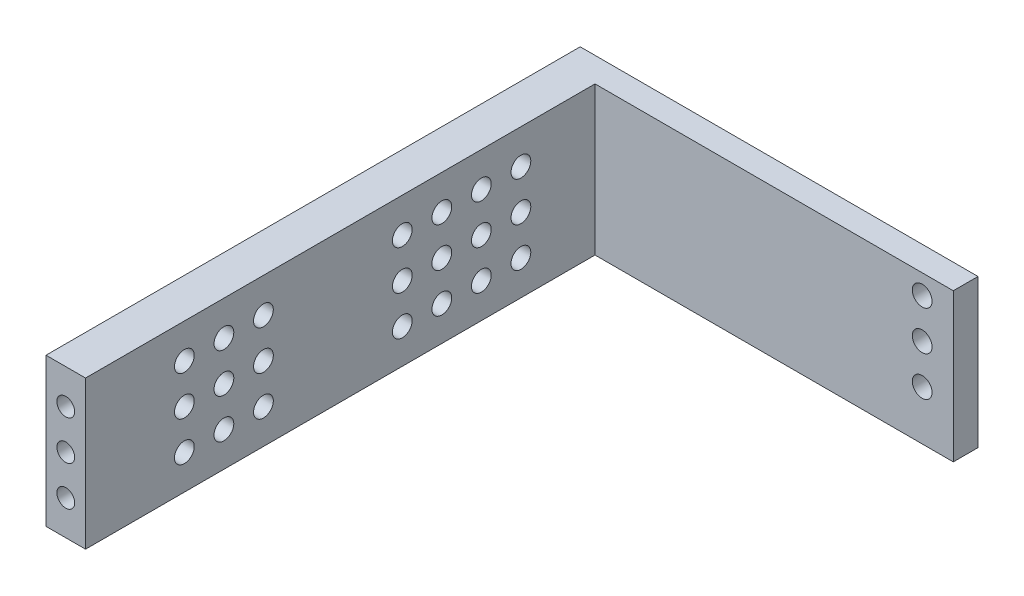
ISO-10303-21;
HEADER;
FILE_DESCRIPTION(('STEP AP214'),'2;1');
FILE_NAME('part.step','',(''),(''),'','','');
FILE_SCHEMA(('AUTOMOTIVE_DESIGN { 1 0 10303 214 1 1 1 1 }'));
ENDSEC;
DATA;
#1=APPLICATION_CONTEXT('core data for automotive mechanical design processes');
#2=APPLICATION_PROTOCOL_DEFINITION('international standard','automotive_design',2000,#1);
#3=PRODUCT_CONTEXT('',#1,'mechanical');
#4=PRODUCT('Part','Part','',(#3));
#5=PRODUCT_RELATED_PRODUCT_CATEGORY('part','',(#4));
#6=PRODUCT_DEFINITION_FORMATION('','',#4);
#7=PRODUCT_DEFINITION_CONTEXT('part definition',#1,'design');
#8=PRODUCT_DEFINITION('design','',#6,#7);
#9=PRODUCT_DEFINITION_SHAPE('','',#8);
#10=(LENGTH_UNIT() NAMED_UNIT(*) SI_UNIT(.MILLI.,.METRE.));
#11=(NAMED_UNIT(*) PLANE_ANGLE_UNIT() SI_UNIT($,.RADIAN.));
#12=(NAMED_UNIT(*) SI_UNIT($,.STERADIAN.) SOLID_ANGLE_UNIT());
#13=UNCERTAINTY_MEASURE_WITH_UNIT(LENGTH_MEASURE(1.E-05),#10,'distance_accuracy_value','');
#14=(GEOMETRIC_REPRESENTATION_CONTEXT(3) GLOBAL_UNCERTAINTY_ASSIGNED_CONTEXT((#13)) GLOBAL_UNIT_ASSIGNED_CONTEXT((#10,
#11,#12)) REPRESENTATION_CONTEXT('',''));
#15=CARTESIAN_POINT('',(0.,0.,0.));
#16=DIRECTION('',(0.,0.,1.));
#17=DIRECTION('',(1.,0.,0.));
#18=AXIS2_PLACEMENT_3D('',#15,#16,#17);
#19=CARTESIAN_POINT('',(8.00000000000002,30.,0.));
#20=DIRECTION('',(0.,0.,-1.));
#21=DIRECTION('',(-1.,0.,0.));
#22=AXIS2_PLACEMENT_3D('',#19,#20,#21);
#23=PLANE('',#22);
#24=CARTESIAN_POINT('',(4.00000000000001,23.,0.));
#25=DIRECTION('',(0.,0.,1.));
#26=DIRECTION('',(1.,0.,0.));
#27=AXIS2_PLACEMENT_3D('',#24,#25,#26);
#28=CIRCLE('',#27,1.8);
#29=CARTESIAN_POINT('',(5.80000000000001,23.,0.));
#30=VERTEX_POINT('',#29);
#31=EDGE_CURVE('E164',#30,#30,#28,.T.);
#32=ORIENTED_EDGE('',*,*,#31,.F.);
#33=EDGE_LOOP('',(#32));
#34=FACE_BOUND('',#33,.T.);
#35=CARTESIAN_POINT('',(4.00000000000001,7.,0.));
#36=DIRECTION('',(0.,0.,1.));
#37=DIRECTION('',(1.,0.,0.));
#38=AXIS2_PLACEMENT_3D('',#35,#36,#37);
#39=CIRCLE('',#38,1.8);
#40=CARTESIAN_POINT('',(5.80000000000001,7.,0.));
#41=VERTEX_POINT('',#40);
#42=EDGE_CURVE('E168',#41,#41,#39,.T.);
#43=ORIENTED_EDGE('',*,*,#42,.F.);
#44=EDGE_LOOP('',(#43));
#45=FACE_BOUND('',#44,.T.);
#46=CARTESIAN_POINT('',(4.00000000000001,15.,0.));
#47=DIRECTION('',(0.,0.,1.));
#48=DIRECTION('',(1.,0.,0.));
#49=AXIS2_PLACEMENT_3D('',#46,#47,#48);
#50=CIRCLE('',#49,1.8);
#51=CARTESIAN_POINT('',(5.80000000000001,15.,0.));
#52=VERTEX_POINT('',#51);
#53=EDGE_CURVE('E171',#52,#52,#50,.T.);
#54=ORIENTED_EDGE('',*,*,#53,.F.);
#55=EDGE_LOOP('',(#54));
#56=FACE_BOUND('',#55,.T.);
#57=DIRECTION('',(1.,0.,0.));
#58=VECTOR('',#57,1.);
#59=CARTESIAN_POINT('',(8.00000000000002,0.,0.));
#60=LINE('',#59,#58);
#61=CARTESIAN_POINT('',(0.,0.,0.));
#62=VERTEX_POINT('',#61);
#63=CARTESIAN_POINT('',(8.00000000000002,0.,0.));
#64=VERTEX_POINT('',#63);
#65=EDGE_CURVE('E116',#62,#64,#60,.T.);
#66=ORIENTED_EDGE('',*,*,#65,.T.);
#67=DIRECTION('',(0.,-1.,0.));
#68=VECTOR('',#67,1.);
#69=CARTESIAN_POINT('',(8.00000000000002,30.,0.));
#70=LINE('',#69,#68);
#71=CARTESIAN_POINT('',(8.00000000000002,30.,0.));
#72=VERTEX_POINT('',#71);
#73=EDGE_CURVE('E11',#72,#64,#70,.T.);
#74=ORIENTED_EDGE('',*,*,#73,.F.);
#75=DIRECTION('',(1.,0.,0.));
#76=VECTOR('',#75,1.);
#77=CARTESIAN_POINT('',(8.00000000000002,30.,0.));
#78=LINE('',#77,#76);
#79=CARTESIAN_POINT('',(0.,30.,0.));
#80=VERTEX_POINT('',#79);
#81=EDGE_CURVE('E127',#80,#72,#78,.T.);
#82=ORIENTED_EDGE('',*,*,#81,.F.);
#83=DIRECTION('',(0.,-1.,0.));
#84=VECTOR('',#83,1.);
#85=CARTESIAN_POINT('',(0.,30.,0.));
#86=LINE('',#85,#84);
#87=EDGE_CURVE('E112',#80,#62,#86,.T.);
#88=ORIENTED_EDGE('',*,*,#87,.T.);
#89=EDGE_LOOP('',(#66,#74,#82,#88));
#90=FACE_BOUND('',#89,.T.);
#91=ADVANCED_FACE('F32',(#34,#45,#56,#90),#23,.F.);
#92=CARTESIAN_POINT('',(8.00000000000001,30.,-103.1));
#93=DIRECTION('',(-1.,0.,0.));
#94=DIRECTION('',(0.,0.,1.));
#95=AXIS2_PLACEMENT_3D('',#92,#93,#94);
#96=PLANE('',#95);
#97=CARTESIAN_POINT('',(8.00000000000001,6.99999999999994,-28.));
#98=DIRECTION('',(-1.,0.,0.));
#99=DIRECTION('',(0.,0.,1.));
#100=AXIS2_PLACEMENT_3D('',#97,#98,#99);
#101=CIRCLE('',#100,2.);
#102=CARTESIAN_POINT('',(8.00000000000001,6.99999999999994,-26.));
#103=VERTEX_POINT('',#102);
#104=EDGE_CURVE('E120',#103,#103,#101,.T.);
#105=ORIENTED_EDGE('',*,*,#104,.T.);
#106=EDGE_LOOP('',(#105));
#107=FACE_BOUND('',#106,.T.);
#108=CARTESIAN_POINT('',(8.00000000000001,22.9999999999999,-36.));
#109=DIRECTION('',(-1.,0.,0.));
#110=DIRECTION('',(0.,0.,1.));
#111=AXIS2_PLACEMENT_3D('',#108,#109,#110);
#112=CIRCLE('',#111,2.);
#113=CARTESIAN_POINT('',(8.00000000000001,22.9999999999999,-34.));
#114=VERTEX_POINT('',#113);
#115=EDGE_CURVE('E318',#114,#114,#112,.T.);
#116=ORIENTED_EDGE('',*,*,#115,.T.);
#117=EDGE_LOOP('',(#116));
#118=FACE_BOUND('',#117,.T.);
#119=CARTESIAN_POINT('',(8.00000000000001,14.9999999999999,-36.));
#120=DIRECTION('',(-1.,0.,0.));
#121=DIRECTION('',(0.,0.,1.));
#122=AXIS2_PLACEMENT_3D('',#119,#120,#121);
#123=CIRCLE('',#122,2.);
#124=CARTESIAN_POINT('',(8.00000000000001,14.9999999999999,-34.));
#125=VERTEX_POINT('',#124);
#126=EDGE_CURVE('E315',#125,#125,#123,.T.);
#127=ORIENTED_EDGE('',*,*,#126,.T.);
#128=EDGE_LOOP('',(#127));
#129=FACE_BOUND('',#128,.T.);
#130=CARTESIAN_POINT('',(8.00000000000001,6.99999999999989,-36.));
#131=DIRECTION('',(-1.,0.,0.));
#132=DIRECTION('',(0.,0.,1.));
#133=AXIS2_PLACEMENT_3D('',#130,#131,#132);
#134=CIRCLE('',#133,2.);
#135=CARTESIAN_POINT('',(8.00000000000001,6.99999999999989,-34.));
#136=VERTEX_POINT('',#135);
#137=EDGE_CURVE('E312',#136,#136,#134,.T.);
#138=ORIENTED_EDGE('',*,*,#137,.T.);
#139=EDGE_LOOP('',(#138));
#140=FACE_BOUND('',#139,.T.);
#141=CARTESIAN_POINT('',(8.00000000000001,14.9999999999999,-28.));
#142=DIRECTION('',(-1.,0.,0.));
#143=DIRECTION('',(0.,0.,1.));
#144=AXIS2_PLACEMENT_3D('',#141,#142,#143);
#145=CIRCLE('',#144,2.);
#146=CARTESIAN_POINT('',(8.00000000000001,14.9999999999999,-26.));
#147=VERTEX_POINT('',#146);
#148=EDGE_CURVE('E309',#147,#147,#145,.T.);
#149=ORIENTED_EDGE('',*,*,#148,.T.);
#150=EDGE_LOOP('',(#149));
#151=FACE_BOUND('',#150,.T.);
#152=CARTESIAN_POINT('',(8.00000000000001,22.9999999999999,-28.));
#153=DIRECTION('',(-1.,0.,0.));
#154=DIRECTION('',(0.,0.,1.));
#155=AXIS2_PLACEMENT_3D('',#152,#153,#154);
#156=CIRCLE('',#155,2.);
#157=CARTESIAN_POINT('',(8.00000000000001,22.9999999999999,-26.));
#158=VERTEX_POINT('',#157);
#159=EDGE_CURVE('E306',#158,#158,#156,.T.);
#160=ORIENTED_EDGE('',*,*,#159,.T.);
#161=EDGE_LOOP('',(#160));
#162=FACE_BOUND('',#161,.T.);
#163=CARTESIAN_POINT('',(8.00000000000002,7.,-20.));
#164=DIRECTION('',(-1.,0.,0.));
#165=DIRECTION('',(0.,0.,1.));
#166=AXIS2_PLACEMENT_3D('',#163,#164,#165);
#167=CIRCLE('',#166,2.);
#168=CARTESIAN_POINT('',(8.00000000000002,7.,-18.));
#169=VERTEX_POINT('',#168);
#170=EDGE_CURVE('E303',#169,#169,#167,.T.);
#171=ORIENTED_EDGE('',*,*,#170,.T.);
#172=EDGE_LOOP('',(#171));
#173=FACE_BOUND('',#172,.T.);
#174=CARTESIAN_POINT('',(8.00000000000002,15.,-20.));
#175=DIRECTION('',(-1.,0.,0.));
#176=DIRECTION('',(0.,0.,1.));
#177=AXIS2_PLACEMENT_3D('',#174,#175,#176);
#178=CIRCLE('',#177,2.);
#179=CARTESIAN_POINT('',(8.00000000000002,15.,-18.));
#180=VERTEX_POINT('',#179);
#181=EDGE_CURVE('E300',#180,#180,#178,.T.);
#182=ORIENTED_EDGE('',*,*,#181,.T.);
#183=EDGE_LOOP('',(#182));
#184=FACE_BOUND('',#183,.T.);
#185=CARTESIAN_POINT('',(8.00000000000001,14.9999999999998,-80.1));
#186=DIRECTION('',(-1.,0.,0.));
#187=DIRECTION('',(0.,0.,1.));
#188=AXIS2_PLACEMENT_3D('',#185,#186,#187);
#189=CIRCLE('',#188,2.);
#190=CARTESIAN_POINT('',(8.00000000000001,14.9999999999998,-78.1));
#191=VERTEX_POINT('',#190);
#192=EDGE_CURVE('E297',#191,#191,#189,.T.);
#193=ORIENTED_EDGE('',*,*,#192,.T.);
#194=EDGE_LOOP('',(#193));
#195=FACE_BOUND('',#194,.T.);
#196=CARTESIAN_POINT('',(8.00000000000001,22.9999999999998,-80.1));
#197=DIRECTION('',(-1.,0.,0.));
#198=DIRECTION('',(0.,0.,1.));
#199=AXIS2_PLACEMENT_3D('',#196,#197,#198);
#200=CIRCLE('',#199,2.);
#201=CARTESIAN_POINT('',(8.00000000000001,22.9999999999998,-78.1));
#202=VERTEX_POINT('',#201);
#203=EDGE_CURVE('E294',#202,#202,#200,.T.);
#204=ORIENTED_EDGE('',*,*,#203,.T.);
#205=EDGE_LOOP('',(#204));
#206=FACE_BOUND('',#205,.T.);
#207=CARTESIAN_POINT('',(8.00000000000001,6.99999999999983,-72.1));
#208=DIRECTION('',(-1.,0.,0.));
#209=DIRECTION('',(0.,0.,1.));
#210=AXIS2_PLACEMENT_3D('',#207,#208,#209);
#211=CIRCLE('',#210,2.);
#212=CARTESIAN_POINT('',(8.00000000000001,6.99999999999983,-70.1));
#213=VERTEX_POINT('',#212);
#214=EDGE_CURVE('E291',#213,#213,#211,.T.);
#215=ORIENTED_EDGE('',*,*,#214,.T.);
#216=EDGE_LOOP('',(#215));
#217=FACE_BOUND('',#216,.T.);
#218=CARTESIAN_POINT('',(8.00000000000001,14.9999999999998,-72.1));
#219=DIRECTION('',(-1.,0.,0.));
#220=DIRECTION('',(0.,0.,1.));
#221=AXIS2_PLACEMENT_3D('',#218,#219,#220);
#222=CIRCLE('',#221,2.);
#223=CARTESIAN_POINT('',(8.00000000000001,14.9999999999998,-70.1));
#224=VERTEX_POINT('',#223);
#225=EDGE_CURVE('E288',#224,#224,#222,.T.);
#226=ORIENTED_EDGE('',*,*,#225,.T.);
#227=EDGE_LOOP('',(#226));
#228=FACE_BOUND('',#227,.T.);
#229=CARTESIAN_POINT('',(8.00000000000001,22.9999999999999,-64.1));
#230=DIRECTION('',(-1.,0.,0.));
#231=DIRECTION('',(0.,0.,1.));
#232=AXIS2_PLACEMENT_3D('',#229,#230,#231);
#233=CIRCLE('',#232,2.);
#234=CARTESIAN_POINT('',(8.00000000000001,22.9999999999999,-62.1));
#235=VERTEX_POINT('',#234);
#236=EDGE_CURVE('E285',#235,#235,#233,.T.);
#237=ORIENTED_EDGE('',*,*,#236,.T.);
#238=EDGE_LOOP('',(#237));
#239=FACE_BOUND('',#238,.T.);
#240=CARTESIAN_POINT('',(8.00000000000001,14.9999999999999,-64.1));
#241=DIRECTION('',(-1.,0.,0.));
#242=DIRECTION('',(0.,0.,1.));
#243=AXIS2_PLACEMENT_3D('',#240,#241,#242);
#244=CIRCLE('',#243,2.);
#245=CARTESIAN_POINT('',(8.00000000000001,14.9999999999999,-62.1));
#246=VERTEX_POINT('',#245);
#247=EDGE_CURVE('E282',#246,#246,#244,.T.);
#248=ORIENTED_EDGE('',*,*,#247,.T.);
#249=EDGE_LOOP('',(#248));
#250=FACE_BOUND('',#249,.T.);
#251=CARTESIAN_POINT('',(8.00000000000001,6.99999999999989,-64.1));
#252=DIRECTION('',(-1.,0.,0.));
#253=DIRECTION('',(0.,0.,1.));
#254=AXIS2_PLACEMENT_3D('',#251,#252,#253);
#255=CIRCLE('',#254,2.);
#256=CARTESIAN_POINT('',(8.00000000000001,6.99999999999989,-62.1));
#257=VERTEX_POINT('',#256);
#258=EDGE_CURVE('E279',#257,#257,#255,.T.);
#259=ORIENTED_EDGE('',*,*,#258,.T.);
#260=EDGE_LOOP('',(#259));
#261=FACE_BOUND('',#260,.T.);
#262=CARTESIAN_POINT('',(8.00000000000001,22.9999999999998,-72.1));
#263=DIRECTION('',(-1.,0.,0.));
#264=DIRECTION('',(0.,0.,1.));
#265=AXIS2_PLACEMENT_3D('',#262,#263,#264);
#266=CIRCLE('',#265,2.);
#267=CARTESIAN_POINT('',(8.00000000000001,22.9999999999998,-70.1));
#268=VERTEX_POINT('',#267);
#269=EDGE_CURVE('E276',#268,#268,#266,.T.);
#270=ORIENTED_EDGE('',*,*,#269,.T.);
#271=EDGE_LOOP('',(#270));
#272=FACE_BOUND('',#271,.T.);
#273=CARTESIAN_POINT('',(8.00000000000001,6.99999999999972,-88.1));
#274=DIRECTION('',(-1.,0.,0.));
#275=DIRECTION('',(0.,0.,1.));
#276=AXIS2_PLACEMENT_3D('',#273,#274,#275);
#277=CIRCLE('',#276,2.);
#278=CARTESIAN_POINT('',(8.00000000000001,6.99999999999972,-86.1));
#279=VERTEX_POINT('',#278);
#280=EDGE_CURVE('E273',#279,#279,#277,.T.);
#281=ORIENTED_EDGE('',*,*,#280,.T.);
#282=EDGE_LOOP('',(#281));
#283=FACE_BOUND('',#282,.T.);
#284=CARTESIAN_POINT('',(8.00000000000001,14.9999999999997,-88.1));
#285=DIRECTION('',(-1.,0.,0.));
#286=DIRECTION('',(0.,0.,1.));
#287=AXIS2_PLACEMENT_3D('',#284,#285,#286);
#288=CIRCLE('',#287,2.);
#289=CARTESIAN_POINT('',(8.00000000000001,14.9999999999997,-86.1));
#290=VERTEX_POINT('',#289);
#291=EDGE_CURVE('E270',#290,#290,#288,.T.);
#292=ORIENTED_EDGE('',*,*,#291,.T.);
#293=EDGE_LOOP('',(#292));
#294=FACE_BOUND('',#293,.T.);
#295=CARTESIAN_POINT('',(8.00000000000001,22.9999999999997,-88.1));
#296=DIRECTION('',(-1.,0.,0.));
#297=DIRECTION('',(0.,0.,1.));
#298=AXIS2_PLACEMENT_3D('',#295,#296,#297);
#299=CIRCLE('',#298,2.);
#300=CARTESIAN_POINT('',(8.00000000000001,22.9999999999997,-86.1));
#301=VERTEX_POINT('',#300);
#302=EDGE_CURVE('E267',#301,#301,#299,.T.);
#303=ORIENTED_EDGE('',*,*,#302,.T.);
#304=EDGE_LOOP('',(#303));
#305=FACE_BOUND('',#304,.T.);
#306=CARTESIAN_POINT('',(8.00000000000001,6.99999999999978,-80.1));
#307=DIRECTION('',(-1.,0.,0.));
#308=DIRECTION('',(0.,0.,1.));
#309=AXIS2_PLACEMENT_3D('',#306,#307,#308);
#310=CIRCLE('',#309,2.);
#311=CARTESIAN_POINT('',(8.00000000000001,6.99999999999978,-78.1));
#312=VERTEX_POINT('',#311);
#313=EDGE_CURVE('E264',#312,#312,#310,.T.);
#314=ORIENTED_EDGE('',*,*,#313,.T.);
#315=EDGE_LOOP('',(#314));
#316=FACE_BOUND('',#315,.T.);
#317=CARTESIAN_POINT('',(8.00000000000002,23.,-20.));
#318=DIRECTION('',(-1.,0.,0.));
#319=DIRECTION('',(0.,0.,1.));
#320=AXIS2_PLACEMENT_3D('',#317,#318,#319);
#321=CIRCLE('',#320,2.);
#322=CARTESIAN_POINT('',(8.00000000000002,23.,-18.));
#323=VERTEX_POINT('',#322);
#324=EDGE_CURVE('E261',#323,#323,#321,.T.);
#325=ORIENTED_EDGE('',*,*,#324,.T.);
#326=EDGE_LOOP('',(#325));
#327=FACE_BOUND('',#326,.T.);
#328=DIRECTION('',(0.,0.,-1.));
#329=VECTOR('',#328,1.);
#330=CARTESIAN_POINT('',(8.00000000000001,0.,-103.1));
#331=LINE('',#330,#329);
#332=CARTESIAN_POINT('',(8.00000000000001,0.,-103.1));
#333=VERTEX_POINT('',#332);
#334=EDGE_CURVE('E119',#64,#333,#331,.T.);
#335=ORIENTED_EDGE('',*,*,#334,.T.);
#336=DIRECTION('',(0.,-1.,0.));
#337=VECTOR('',#336,1.);
#338=CARTESIAN_POINT('',(8.00000000000001,30.,-103.1));
#339=LINE('',#338,#337);
#340=CARTESIAN_POINT('',(8.00000000000001,30.,-103.1));
#341=VERTEX_POINT('',#340);
#342=EDGE_CURVE('E40',#341,#333,#339,.T.);
#343=ORIENTED_EDGE('',*,*,#342,.F.);
#344=DIRECTION('',(0.,0.,-1.));
#345=VECTOR('',#344,1.);
#346=CARTESIAN_POINT('',(8.00000000000001,30.,-103.1));
#347=LINE('',#346,#345);
#348=EDGE_CURVE('E85',#72,#341,#347,.T.);
#349=ORIENTED_EDGE('',*,*,#348,.F.);
#350=ORIENTED_EDGE('',*,*,#73,.T.);
#351=EDGE_LOOP('',(#335,#343,#349,#350));
#352=FACE_BOUND('',#351,.T.);
#353=ADVANCED_FACE('F155',(#107,#118,#129,#140,#151,#162,#173,#184,#195,#206,#217,#228,#239,
#250,#261,#272,#283,#294,#305,#316,#327,#352),#96,.F.);
#354=CARTESIAN_POINT('',(80.5,30.,-103.1));
#355=DIRECTION('',(0.,0.,-1.));
#356=DIRECTION('',(-1.,0.,0.));
#357=AXIS2_PLACEMENT_3D('',#354,#355,#356);
#358=PLANE('',#357);
#359=CARTESIAN_POINT('',(74.2,26.,-103.1));
#360=DIRECTION('',(0.,0.,-1.));
#361=DIRECTION('',(-1.,0.,0.));
#362=AXIS2_PLACEMENT_3D('',#359,#360,#361);
#363=CIRCLE('',#362,2.);
#364=CARTESIAN_POINT('',(72.2,26.,-103.1));
#365=VERTEX_POINT('',#364);
#366=EDGE_CURVE('E195',#365,#365,#363,.T.);
#367=ORIENTED_EDGE('',*,*,#366,.T.);
#368=EDGE_LOOP('',(#367));
#369=FACE_BOUND('',#368,.T.);
#370=CARTESIAN_POINT('',(74.2,18.,-103.1));
#371=DIRECTION('',(0.,0.,-1.));
#372=DIRECTION('',(-1.,0.,0.));
#373=AXIS2_PLACEMENT_3D('',#370,#371,#372);
#374=CIRCLE('',#373,2.);
#375=CARTESIAN_POINT('',(72.2,18.,-103.1));
#376=VERTEX_POINT('',#375);
#377=EDGE_CURVE('E192',#376,#376,#374,.T.);
#378=ORIENTED_EDGE('',*,*,#377,.T.);
#379=EDGE_LOOP('',(#378));
#380=FACE_BOUND('',#379,.T.);
#381=CARTESIAN_POINT('',(74.2,10.,-103.1));
#382=DIRECTION('',(0.,0.,-1.));
#383=DIRECTION('',(-1.,0.,0.));
#384=AXIS2_PLACEMENT_3D('',#381,#382,#383);
#385=CIRCLE('',#384,2.);
#386=CARTESIAN_POINT('',(72.2,10.,-103.1));
#387=VERTEX_POINT('',#386);
#388=EDGE_CURVE('E182',#387,#387,#385,.T.);
#389=ORIENTED_EDGE('',*,*,#388,.T.);
#390=EDGE_LOOP('',(#389));
#391=FACE_BOUND('',#390,.T.);
#392=DIRECTION('',(1.,0.,0.));
#393=VECTOR('',#392,1.);
#394=CARTESIAN_POINT('',(80.5,0.,-103.1));
#395=LINE('',#394,#393);
#396=CARTESIAN_POINT('',(80.5,0.,-103.1));
#397=VERTEX_POINT('',#396);
#398=EDGE_CURVE('E122',#333,#397,#395,.T.);
#399=ORIENTED_EDGE('',*,*,#398,.T.);
#400=DIRECTION('',(0.,-1.,0.));
#401=VECTOR('',#400,1.);
#402=CARTESIAN_POINT('',(80.5,30.,-103.1));
#403=LINE('',#402,#401);
#404=CARTESIAN_POINT('',(80.5,30.,-103.1));
#405=VERTEX_POINT('',#404);
#406=EDGE_CURVE('E107',#405,#397,#403,.T.);
#407=ORIENTED_EDGE('',*,*,#406,.F.);
#408=DIRECTION('',(1.,0.,0.));
#409=VECTOR('',#408,1.);
#410=CARTESIAN_POINT('',(80.5,30.,-103.1));
#411=LINE('',#410,#409);
#412=EDGE_CURVE('E98',#341,#405,#411,.T.);
#413=ORIENTED_EDGE('',*,*,#412,.F.);
#414=ORIENTED_EDGE('',*,*,#342,.T.);
#415=EDGE_LOOP('',(#399,#407,#413,#414));
#416=FACE_BOUND('',#415,.T.);
#417=ADVANCED_FACE('F133',(#369,#380,#391,#416),#358,.F.);
#418=CARTESIAN_POINT('',(80.5,30.,-108.1));
#419=DIRECTION('',(-1.,0.,0.));
#420=DIRECTION('',(0.,0.,1.));
#421=AXIS2_PLACEMENT_3D('',#418,#419,#420);
#422=PLANE('',#421);
#423=DIRECTION('',(0.,0.,-1.));
#424=VECTOR('',#423,1.);
#425=CARTESIAN_POINT('',(80.5,0.,-108.1));
#426=LINE('',#425,#424);
#427=CARTESIAN_POINT('',(80.5,0.,-108.1));
#428=VERTEX_POINT('',#427);
#429=EDGE_CURVE('E106',#397,#428,#426,.T.);
#430=ORIENTED_EDGE('',*,*,#429,.T.);
#431=DIRECTION('',(0.,-1.,0.));
#432=VECTOR('',#431,1.);
#433=CARTESIAN_POINT('',(80.5,30.,-108.1));
#434=LINE('',#433,#432);
#435=CARTESIAN_POINT('',(80.5,30.,-108.1));
#436=VERTEX_POINT('',#435);
#437=EDGE_CURVE('E103',#436,#428,#434,.T.);
#438=ORIENTED_EDGE('',*,*,#437,.F.);
#439=DIRECTION('',(0.,0.,-1.));
#440=VECTOR('',#439,1.);
#441=CARTESIAN_POINT('',(80.5,30.,-108.1));
#442=LINE('',#441,#440);
#443=EDGE_CURVE('E92',#405,#436,#442,.T.);
#444=ORIENTED_EDGE('',*,*,#443,.F.);
#445=ORIENTED_EDGE('',*,*,#406,.T.);
#446=EDGE_LOOP('',(#430,#438,#444,#445));
#447=FACE_BOUND('',#446,.T.);
#448=ADVANCED_FACE('F104',(#447),#422,.F.);
#449=CARTESIAN_POINT('',(0.,30.,-108.1));
#450=DIRECTION('',(0.,0.,1.));
#451=DIRECTION('',(1.,0.,0.));
#452=AXIS2_PLACEMENT_3D('',#449,#450,#451);
#453=PLANE('',#452);
#454=CARTESIAN_POINT('',(74.2,26.,-108.1));
#455=DIRECTION('',(0.,0.,-1.));
#456=DIRECTION('',(-1.,0.,0.));
#457=AXIS2_PLACEMENT_3D('',#454,#455,#456);
#458=CIRCLE('',#457,2.);
#459=CARTESIAN_POINT('',(72.2,26.,-108.1));
#460=VERTEX_POINT('',#459);
#461=EDGE_CURVE('E179',#460,#460,#458,.T.);
#462=ORIENTED_EDGE('',*,*,#461,.F.);
#463=EDGE_LOOP('',(#462));
#464=FACE_BOUND('',#463,.T.);
#465=CARTESIAN_POINT('',(74.2,18.,-108.1));
#466=DIRECTION('',(0.,0.,-1.));
#467=DIRECTION('',(-1.,0.,0.));
#468=AXIS2_PLACEMENT_3D('',#465,#466,#467);
#469=CIRCLE('',#468,2.);
#470=CARTESIAN_POINT('',(72.2,18.,-108.1));
#471=VERTEX_POINT('',#470);
#472=EDGE_CURVE('E183',#471,#471,#469,.T.);
#473=ORIENTED_EDGE('',*,*,#472,.F.);
#474=EDGE_LOOP('',(#473));
#475=FACE_BOUND('',#474,.T.);
#476=CARTESIAN_POINT('',(74.2,10.,-108.1));
#477=DIRECTION('',(0.,0.,-1.));
#478=DIRECTION('',(-1.,0.,0.));
#479=AXIS2_PLACEMENT_3D('',#476,#477,#478);
#480=CIRCLE('',#479,2.);
#481=CARTESIAN_POINT('',(72.2,10.,-108.1));
#482=VERTEX_POINT('',#481);
#483=EDGE_CURVE('E186',#482,#482,#480,.T.);
#484=ORIENTED_EDGE('',*,*,#483,.F.);
#485=EDGE_LOOP('',(#484));
#486=FACE_BOUND('',#485,.T.);
#487=DIRECTION('',(-1.,0.,0.));
#488=VECTOR('',#487,1.);
#489=CARTESIAN_POINT('',(0.,0.,-108.1));
#490=LINE('',#489,#488);
#491=CARTESIAN_POINT('',(0.,0.,-108.1));
#492=VERTEX_POINT('',#491);
#493=EDGE_CURVE('E71',#428,#492,#490,.T.);
#494=ORIENTED_EDGE('',*,*,#493,.T.);
#495=DIRECTION('',(0.,-1.,0.));
#496=VECTOR('',#495,1.);
#497=CARTESIAN_POINT('',(0.,30.,-108.1));
#498=LINE('',#497,#496);
#499=CARTESIAN_POINT('',(0.,30.,-108.1));
#500=VERTEX_POINT('',#499);
#501=EDGE_CURVE('E108',#500,#492,#498,.T.);
#502=ORIENTED_EDGE('',*,*,#501,.F.);
#503=DIRECTION('',(-1.,0.,0.));
#504=VECTOR('',#503,1.);
#505=CARTESIAN_POINT('',(0.,30.,-108.1));
#506=LINE('',#505,#504);
#507=EDGE_CURVE('E96',#436,#500,#506,.T.);
#508=ORIENTED_EDGE('',*,*,#507,.F.);
#509=ORIENTED_EDGE('',*,*,#437,.T.);
#510=EDGE_LOOP('',(#494,#502,#508,#509));
#511=FACE_BOUND('',#510,.T.);
#512=ADVANCED_FACE('F110',(#464,#475,#486,#511),#453,.F.);
#513=CARTESIAN_POINT('',(0.,30.,0.));
#514=DIRECTION('',(1.,0.,0.));
#515=DIRECTION('',(0.,0.,-1.));
#516=AXIS2_PLACEMENT_3D('',#513,#514,#515);
#517=PLANE('',#516);
#518=CARTESIAN_POINT('',(0.,6.99999999999994,-28.));
#519=DIRECTION('',(-1.,0.,0.));
#520=DIRECTION('',(0.,0.,1.));
#521=AXIS2_PLACEMENT_3D('',#518,#519,#520);
#522=CIRCLE('',#521,2.);
#523=CARTESIAN_POINT('',(0.,6.99999999999994,-26.));
#524=VERTEX_POINT('',#523);
#525=EDGE_CURVE('E219',#524,#524,#522,.T.);
#526=ORIENTED_EDGE('',*,*,#525,.F.);
#527=EDGE_LOOP('',(#526));
#528=FACE_BOUND('',#527,.T.);
#529=CARTESIAN_POINT('',(0.,22.9999999999999,-36.));
#530=DIRECTION('',(-1.,0.,0.));
#531=DIRECTION('',(0.,0.,1.));
#532=AXIS2_PLACEMENT_3D('',#529,#530,#531);
#533=CIRCLE('',#532,2.);
#534=CARTESIAN_POINT('',(0.,22.9999999999999,-34.));
#535=VERTEX_POINT('',#534);
#536=EDGE_CURVE('E214',#535,#535,#533,.T.);
#537=ORIENTED_EDGE('',*,*,#536,.F.);
#538=EDGE_LOOP('',(#537));
#539=FACE_BOUND('',#538,.T.);
#540=CARTESIAN_POINT('',(0.,14.9999999999999,-36.));
#541=DIRECTION('',(-1.,0.,0.));
#542=DIRECTION('',(0.,0.,1.));
#543=AXIS2_PLACEMENT_3D('',#540,#541,#542);
#544=CIRCLE('',#543,2.);
#545=CARTESIAN_POINT('',(0.,14.9999999999999,-34.));
#546=VERTEX_POINT('',#545);
#547=EDGE_CURVE('E211',#546,#546,#544,.T.);
#548=ORIENTED_EDGE('',*,*,#547,.F.);
#549=EDGE_LOOP('',(#548));
#550=FACE_BOUND('',#549,.T.);
#551=CARTESIAN_POINT('',(0.,6.99999999999989,-36.));
#552=DIRECTION('',(-1.,0.,0.));
#553=DIRECTION('',(0.,0.,1.));
#554=AXIS2_PLACEMENT_3D('',#551,#552,#553);
#555=CIRCLE('',#554,2.);
#556=CARTESIAN_POINT('',(0.,6.99999999999989,-34.));
#557=VERTEX_POINT('',#556);
#558=EDGE_CURVE('E215',#557,#557,#555,.T.);
#559=ORIENTED_EDGE('',*,*,#558,.F.);
#560=EDGE_LOOP('',(#559));
#561=FACE_BOUND('',#560,.T.);
#562=CARTESIAN_POINT('',(0.,14.9999999999999,-28.));
#563=DIRECTION('',(-1.,0.,0.));
#564=DIRECTION('',(0.,0.,1.));
#565=AXIS2_PLACEMENT_3D('',#562,#563,#564);
#566=CIRCLE('',#565,2.);
#567=CARTESIAN_POINT('',(0.,14.9999999999999,-26.));
#568=VERTEX_POINT('',#567);
#569=EDGE_CURVE('E222',#568,#568,#566,.T.);
#570=ORIENTED_EDGE('',*,*,#569,.F.);
#571=EDGE_LOOP('',(#570));
#572=FACE_BOUND('',#571,.T.);
#573=CARTESIAN_POINT('',(0.,22.9999999999999,-28.));
#574=DIRECTION('',(-1.,0.,0.));
#575=DIRECTION('',(0.,0.,1.));
#576=AXIS2_PLACEMENT_3D('',#573,#574,#575);
#577=CIRCLE('',#576,2.);
#578=CARTESIAN_POINT('',(0.,22.9999999999999,-26.));
#579=VERTEX_POINT('',#578);
#580=EDGE_CURVE('E232',#579,#579,#577,.T.);
#581=ORIENTED_EDGE('',*,*,#580,.F.);
#582=EDGE_LOOP('',(#581));
#583=FACE_BOUND('',#582,.T.);
#584=CARTESIAN_POINT('',(0.,7.,-20.));
#585=DIRECTION('',(-1.,0.,0.));
#586=DIRECTION('',(0.,0.,1.));
#587=AXIS2_PLACEMENT_3D('',#584,#585,#586);
#588=CIRCLE('',#587,2.);
#589=CARTESIAN_POINT('',(0.,7.,-18.));
#590=VERTEX_POINT('',#589);
#591=EDGE_CURVE('E229',#590,#590,#588,.T.);
#592=ORIENTED_EDGE('',*,*,#591,.F.);
#593=EDGE_LOOP('',(#592));
#594=FACE_BOUND('',#593,.T.);
#595=CARTESIAN_POINT('',(0.,15.,-20.));
#596=DIRECTION('',(-1.,0.,0.));
#597=DIRECTION('',(0.,0.,1.));
#598=AXIS2_PLACEMENT_3D('',#595,#596,#597);
#599=CIRCLE('',#598,2.);
#600=CARTESIAN_POINT('',(0.,15.,-18.));
#601=VERTEX_POINT('',#600);
#602=EDGE_CURVE('E225',#601,#601,#599,.T.);
#603=ORIENTED_EDGE('',*,*,#602,.F.);
#604=EDGE_LOOP('',(#603));
#605=FACE_BOUND('',#604,.T.);
#606=CARTESIAN_POINT('',(0.,14.9999999999998,-80.1));
#607=DIRECTION('',(-1.,0.,0.));
#608=DIRECTION('',(0.,0.,1.));
#609=AXIS2_PLACEMENT_3D('',#606,#607,#608);
#610=CIRCLE('',#609,2.);
#611=CARTESIAN_POINT('',(0.,14.9999999999998,-78.1));
#612=VERTEX_POINT('',#611);
#613=EDGE_CURVE('E208',#612,#612,#610,.T.);
#614=ORIENTED_EDGE('',*,*,#613,.F.);
#615=EDGE_LOOP('',(#614));
#616=FACE_BOUND('',#615,.T.);
#617=CARTESIAN_POINT('',(0.,22.9999999999998,-80.1));
#618=DIRECTION('',(-1.,0.,0.));
#619=DIRECTION('',(0.,0.,1.));
#620=AXIS2_PLACEMENT_3D('',#617,#618,#619);
#621=CIRCLE('',#620,2.);
#622=CARTESIAN_POINT('',(0.,22.9999999999998,-78.1));
#623=VERTEX_POINT('',#622);
#624=EDGE_CURVE('E244',#623,#623,#621,.T.);
#625=ORIENTED_EDGE('',*,*,#624,.F.);
#626=EDGE_LOOP('',(#625));
#627=FACE_BOUND('',#626,.T.);
#628=CARTESIAN_POINT('',(0.,6.99999999999983,-72.1));
#629=DIRECTION('',(-1.,0.,0.));
#630=DIRECTION('',(0.,0.,1.));
#631=AXIS2_PLACEMENT_3D('',#628,#629,#630);
#632=CIRCLE('',#631,2.);
#633=CARTESIAN_POINT('',(0.,6.99999999999983,-70.1));
#634=VERTEX_POINT('',#633);
#635=EDGE_CURVE('E241',#634,#634,#632,.T.);
#636=ORIENTED_EDGE('',*,*,#635,.F.);
#637=EDGE_LOOP('',(#636));
#638=FACE_BOUND('',#637,.T.);
#639=CARTESIAN_POINT('',(0.,14.9999999999998,-72.1));
#640=DIRECTION('',(-1.,0.,0.));
#641=DIRECTION('',(0.,0.,1.));
#642=AXIS2_PLACEMENT_3D('',#639,#640,#641);
#643=CIRCLE('',#642,2.);
#644=CARTESIAN_POINT('',(0.,14.9999999999998,-70.1));
#645=VERTEX_POINT('',#644);
#646=EDGE_CURVE('E237',#645,#645,#643,.T.);
#647=ORIENTED_EDGE('',*,*,#646,.F.);
#648=EDGE_LOOP('',(#647));
#649=FACE_BOUND('',#648,.T.);
#650=CARTESIAN_POINT('',(0.,22.9999999999999,-64.1));
#651=DIRECTION('',(-1.,0.,0.));
#652=DIRECTION('',(0.,0.,1.));
#653=AXIS2_PLACEMENT_3D('',#650,#651,#652);
#654=CIRCLE('',#653,2.);
#655=CARTESIAN_POINT('',(0.,22.9999999999999,-62.1));
#656=VERTEX_POINT('',#655);
#657=EDGE_CURVE('E218',#656,#656,#654,.T.);
#658=ORIENTED_EDGE('',*,*,#657,.F.);
#659=EDGE_LOOP('',(#658));
#660=FACE_BOUND('',#659,.T.);
#661=CARTESIAN_POINT('',(0.,14.9999999999999,-64.1));
#662=DIRECTION('',(-1.,0.,0.));
#663=DIRECTION('',(0.,0.,1.));
#664=AXIS2_PLACEMENT_3D('',#661,#662,#663);
#665=CIRCLE('',#664,2.);
#666=CARTESIAN_POINT('',(0.,14.9999999999999,-62.1));
#667=VERTEX_POINT('',#666);
#668=EDGE_CURVE('E252',#667,#667,#665,.T.);
#669=ORIENTED_EDGE('',*,*,#668,.F.);
#670=EDGE_LOOP('',(#669));
#671=FACE_BOUND('',#670,.T.);
#672=CARTESIAN_POINT('',(0.,6.99999999999989,-64.1));
#673=DIRECTION('',(-1.,0.,0.));
#674=DIRECTION('',(0.,0.,1.));
#675=AXIS2_PLACEMENT_3D('',#672,#673,#674);
#676=CIRCLE('',#675,2.);
#677=CARTESIAN_POINT('',(0.,6.99999999999989,-62.1));
#678=VERTEX_POINT('',#677);
#679=EDGE_CURVE('E249',#678,#678,#676,.T.);
#680=ORIENTED_EDGE('',*,*,#679,.F.);
#681=EDGE_LOOP('',(#680));
#682=FACE_BOUND('',#681,.T.);
#683=CARTESIAN_POINT('',(0.,22.9999999999998,-72.1));
#684=DIRECTION('',(-1.,0.,0.));
#685=DIRECTION('',(0.,0.,1.));
#686=AXIS2_PLACEMENT_3D('',#683,#684,#685);
#687=CIRCLE('',#686,2.);
#688=CARTESIAN_POINT('',(0.,22.9999999999998,-70.1));
#689=VERTEX_POINT('',#688);
#690=EDGE_CURVE('E240',#689,#689,#687,.T.);
#691=ORIENTED_EDGE('',*,*,#690,.F.);
#692=EDGE_LOOP('',(#691));
#693=FACE_BOUND('',#692,.T.);
#694=CARTESIAN_POINT('',(0.,6.99999999999972,-88.1));
#695=DIRECTION('',(-1.,0.,0.));
#696=DIRECTION('',(0.,0.,1.));
#697=AXIS2_PLACEMENT_3D('',#694,#695,#696);
#698=CIRCLE('',#697,2.);
#699=CARTESIAN_POINT('',(0.,6.99999999999972,-86.1));
#700=VERTEX_POINT('',#699);
#701=EDGE_CURVE('E198',#700,#700,#698,.T.);
#702=ORIENTED_EDGE('',*,*,#701,.F.);
#703=EDGE_LOOP('',(#702));
#704=FACE_BOUND('',#703,.T.);
#705=CARTESIAN_POINT('',(0.,14.9999999999997,-88.1));
#706=DIRECTION('',(-1.,0.,0.));
#707=DIRECTION('',(0.,0.,1.));
#708=AXIS2_PLACEMENT_3D('',#705,#706,#707);
#709=CIRCLE('',#708,2.);
#710=CARTESIAN_POINT('',(0.,14.9999999999997,-86.1));
#711=VERTEX_POINT('',#710);
#712=EDGE_CURVE('E199',#711,#711,#709,.T.);
#713=ORIENTED_EDGE('',*,*,#712,.F.);
#714=EDGE_LOOP('',(#713));
#715=FACE_BOUND('',#714,.T.);
#716=CARTESIAN_POINT('',(0.,22.9999999999997,-88.1));
#717=DIRECTION('',(-1.,0.,0.));
#718=DIRECTION('',(0.,0.,1.));
#719=AXIS2_PLACEMENT_3D('',#716,#717,#718);
#720=CIRCLE('',#719,2.);
#721=CARTESIAN_POINT('',(0.,22.9999999999997,-86.1));
#722=VERTEX_POINT('',#721);
#723=EDGE_CURVE('E202',#722,#722,#720,.T.);
#724=ORIENTED_EDGE('',*,*,#723,.F.);
#725=EDGE_LOOP('',(#724));
#726=FACE_BOUND('',#725,.T.);
#727=CARTESIAN_POINT('',(0.,6.99999999999978,-80.1));
#728=DIRECTION('',(-1.,0.,0.));
#729=DIRECTION('',(0.,0.,1.));
#730=AXIS2_PLACEMENT_3D('',#727,#728,#729);
#731=CIRCLE('',#730,2.);
#732=CARTESIAN_POINT('',(0.,6.99999999999978,-78.1));
#733=VERTEX_POINT('',#732);
#734=EDGE_CURVE('E205',#733,#733,#731,.T.);
#735=ORIENTED_EDGE('',*,*,#734,.F.);
#736=EDGE_LOOP('',(#735));
#737=FACE_BOUND('',#736,.T.);
#738=CARTESIAN_POINT('',(0.,23.,-20.));
#739=DIRECTION('',(-1.,0.,0.));
#740=DIRECTION('',(0.,0.,1.));
#741=AXIS2_PLACEMENT_3D('',#738,#739,#740);
#742=CIRCLE('',#741,2.);
#743=CARTESIAN_POINT('',(0.,23.,-18.));
#744=VERTEX_POINT('',#743);
#745=EDGE_CURVE('E228',#744,#744,#742,.T.);
#746=ORIENTED_EDGE('',*,*,#745,.F.);
#747=EDGE_LOOP('',(#746));
#748=FACE_BOUND('',#747,.T.);
#749=DIRECTION('',(0.,0.,1.));
#750=VECTOR('',#749,1.);
#751=CARTESIAN_POINT('',(0.,0.,0.));
#752=LINE('',#751,#750);
#753=EDGE_CURVE('E77',#492,#62,#752,.T.);
#754=ORIENTED_EDGE('',*,*,#753,.T.);
#755=ORIENTED_EDGE('',*,*,#87,.F.);
#756=DIRECTION('',(0.,0.,1.));
#757=VECTOR('',#756,1.);
#758=CARTESIAN_POINT('',(0.,30.,0.));
#759=LINE('',#758,#757);
#760=EDGE_CURVE('E48',#500,#80,#759,.T.);
#761=ORIENTED_EDGE('',*,*,#760,.F.);
#762=ORIENTED_EDGE('',*,*,#501,.T.);
#763=EDGE_LOOP('',(#754,#755,#761,#762));
#764=FACE_BOUND('',#763,.T.);
#765=ADVANCED_FACE('F140',(#528,#539,#550,#561,#572,#583,#594,#605,#616,#627,#638,#649,#660,
#671,#682,#693,#704,#715,#726,#737,#748,#764),#517,.F.);
#766=CARTESIAN_POINT('',(0.,30.,0.));
#767=DIRECTION('',(0.,-1.,0.));
#768=DIRECTION('',(0.,0.,-1.));
#769=AXIS2_PLACEMENT_3D('',#766,#767,#768);
#770=PLANE('',#769);
#771=ORIENTED_EDGE('',*,*,#81,.T.);
#772=ORIENTED_EDGE('',*,*,#348,.T.);
#773=ORIENTED_EDGE('',*,*,#412,.T.);
#774=ORIENTED_EDGE('',*,*,#443,.T.);
#775=ORIENTED_EDGE('',*,*,#507,.T.);
#776=ORIENTED_EDGE('',*,*,#760,.T.);
#777=EDGE_LOOP('',(#771,#772,#773,#774,#775,#776));
#778=FACE_BOUND('',#777,.T.);
#779=ADVANCED_FACE('F94',(#778),#770,.F.);
#780=CARTESIAN_POINT('',(0.,0.,0.));
#781=DIRECTION('',(0.,-1.,0.));
#782=DIRECTION('',(0.,0.,-1.));
#783=AXIS2_PLACEMENT_3D('',#780,#781,#782);
#784=PLANE('',#783);
#785=ORIENTED_EDGE('',*,*,#65,.F.);
#786=ORIENTED_EDGE('',*,*,#753,.F.);
#787=ORIENTED_EDGE('',*,*,#493,.F.);
#788=ORIENTED_EDGE('',*,*,#429,.F.);
#789=ORIENTED_EDGE('',*,*,#398,.F.);
#790=ORIENTED_EDGE('',*,*,#334,.F.);
#791=EDGE_LOOP('',(#785,#786,#787,#788,#789,#790));
#792=FACE_BOUND('',#791,.T.);
#793=ADVANCED_FACE('F136',(#792),#784,.T.);
#794=CARTESIAN_POINT('',(10.,23.,-20.));
#795=DIRECTION('',(-1.,0.,0.));
#796=DIRECTION('',(0.,0.,1.));
#797=AXIS2_PLACEMENT_3D('',#794,#795,#796);
#798=CYLINDRICAL_SURFACE('',#797,2.);
#799=ORIENTED_EDGE('',*,*,#745,.T.);
#800=EDGE_LOOP('',(#799));
#801=FACE_BOUND('',#800,.T.);
#802=ORIENTED_EDGE('',*,*,#324,.F.);
#803=EDGE_LOOP('',(#802));
#804=FACE_BOUND('',#803,.T.);
#805=ADVANCED_FACE('F396',(#801,#804),#798,.F.);
#806=CARTESIAN_POINT('',(10.,6.99999999999978,-80.1));
#807=DIRECTION('',(-1.,0.,0.));
#808=DIRECTION('',(0.,0.,1.));
#809=AXIS2_PLACEMENT_3D('',#806,#807,#808);
#810=CYLINDRICAL_SURFACE('',#809,2.);
#811=ORIENTED_EDGE('',*,*,#734,.T.);
#812=EDGE_LOOP('',(#811));
#813=FACE_BOUND('',#812,.T.);
#814=ORIENTED_EDGE('',*,*,#313,.F.);
#815=EDGE_LOOP('',(#814));
#816=FACE_BOUND('',#815,.T.);
#817=ADVANCED_FACE('F398',(#813,#816),#810,.F.);
#818=CARTESIAN_POINT('',(10.,22.9999999999997,-88.1));
#819=DIRECTION('',(-1.,0.,0.));
#820=DIRECTION('',(0.,0.,1.));
#821=AXIS2_PLACEMENT_3D('',#818,#819,#820);
#822=CYLINDRICAL_SURFACE('',#821,2.);
#823=ORIENTED_EDGE('',*,*,#723,.T.);
#824=EDGE_LOOP('',(#823));
#825=FACE_BOUND('',#824,.T.);
#826=ORIENTED_EDGE('',*,*,#302,.F.);
#827=EDGE_LOOP('',(#826));
#828=FACE_BOUND('',#827,.T.);
#829=ADVANCED_FACE('F416',(#825,#828),#822,.F.);
#830=CARTESIAN_POINT('',(10.,14.9999999999997,-88.1));
#831=DIRECTION('',(-1.,0.,0.));
#832=DIRECTION('',(0.,0.,1.));
#833=AXIS2_PLACEMENT_3D('',#830,#831,#832);
#834=CYLINDRICAL_SURFACE('',#833,2.);
#835=ORIENTED_EDGE('',*,*,#712,.T.);
#836=EDGE_LOOP('',(#835));
#837=FACE_BOUND('',#836,.T.);
#838=ORIENTED_EDGE('',*,*,#291,.F.);
#839=EDGE_LOOP('',(#838));
#840=FACE_BOUND('',#839,.T.);
#841=ADVANCED_FACE('F424',(#837,#840),#834,.F.);
#842=CARTESIAN_POINT('',(10.,6.99999999999972,-88.1));
#843=DIRECTION('',(-1.,0.,0.));
#844=DIRECTION('',(0.,0.,1.));
#845=AXIS2_PLACEMENT_3D('',#842,#843,#844);
#846=CYLINDRICAL_SURFACE('',#845,2.);
#847=ORIENTED_EDGE('',*,*,#701,.T.);
#848=EDGE_LOOP('',(#847));
#849=FACE_BOUND('',#848,.T.);
#850=ORIENTED_EDGE('',*,*,#280,.F.);
#851=EDGE_LOOP('',(#850));
#852=FACE_BOUND('',#851,.T.);
#853=ADVANCED_FACE('F388',(#849,#852),#846,.F.);
#854=CARTESIAN_POINT('',(10.,22.9999999999998,-72.1));
#855=DIRECTION('',(-1.,0.,0.));
#856=DIRECTION('',(0.,0.,1.));
#857=AXIS2_PLACEMENT_3D('',#854,#855,#856);
#858=CYLINDRICAL_SURFACE('',#857,2.);
#859=ORIENTED_EDGE('',*,*,#690,.T.);
#860=EDGE_LOOP('',(#859));
#861=FACE_BOUND('',#860,.T.);
#862=ORIENTED_EDGE('',*,*,#269,.F.);
#863=EDGE_LOOP('',(#862));
#864=FACE_BOUND('',#863,.T.);
#865=ADVANCED_FACE('F384',(#861,#864),#858,.F.);
#866=CARTESIAN_POINT('',(10.,6.99999999999989,-64.1));
#867=DIRECTION('',(-1.,0.,0.));
#868=DIRECTION('',(0.,0.,1.));
#869=AXIS2_PLACEMENT_3D('',#866,#867,#868);
#870=CYLINDRICAL_SURFACE('',#869,2.);
#871=ORIENTED_EDGE('',*,*,#679,.T.);
#872=EDGE_LOOP('',(#871));
#873=FACE_BOUND('',#872,.T.);
#874=ORIENTED_EDGE('',*,*,#258,.F.);
#875=EDGE_LOOP('',(#874));
#876=FACE_BOUND('',#875,.T.);
#877=ADVANCED_FACE('F380',(#873,#876),#870,.F.);
#878=CARTESIAN_POINT('',(10.,14.9999999999999,-64.1));
#879=DIRECTION('',(-1.,0.,0.));
#880=DIRECTION('',(0.,0.,1.));
#881=AXIS2_PLACEMENT_3D('',#878,#879,#880);
#882=CYLINDRICAL_SURFACE('',#881,2.);
#883=ORIENTED_EDGE('',*,*,#668,.T.);
#884=EDGE_LOOP('',(#883));
#885=FACE_BOUND('',#884,.T.);
#886=ORIENTED_EDGE('',*,*,#247,.F.);
#887=EDGE_LOOP('',(#886));
#888=FACE_BOUND('',#887,.T.);
#889=ADVANCED_FACE('F383',(#885,#888),#882,.F.);
#890=CARTESIAN_POINT('',(10.,22.9999999999999,-64.1));
#891=DIRECTION('',(-1.,0.,0.));
#892=DIRECTION('',(0.,0.,1.));
#893=AXIS2_PLACEMENT_3D('',#890,#891,#892);
#894=CYLINDRICAL_SURFACE('',#893,2.);
#895=ORIENTED_EDGE('',*,*,#657,.T.);
#896=EDGE_LOOP('',(#895));
#897=FACE_BOUND('',#896,.T.);
#898=ORIENTED_EDGE('',*,*,#236,.F.);
#899=EDGE_LOOP('',(#898));
#900=FACE_BOUND('',#899,.T.);
#901=ADVANCED_FACE('F368',(#897,#900),#894,.F.);
#902=CARTESIAN_POINT('',(10.,14.9999999999998,-72.1));
#903=DIRECTION('',(-1.,0.,0.));
#904=DIRECTION('',(0.,0.,1.));
#905=AXIS2_PLACEMENT_3D('',#902,#903,#904);
#906=CYLINDRICAL_SURFACE('',#905,2.);
#907=ORIENTED_EDGE('',*,*,#646,.T.);
#908=EDGE_LOOP('',(#907));
#909=FACE_BOUND('',#908,.T.);
#910=ORIENTED_EDGE('',*,*,#225,.F.);
#911=EDGE_LOOP('',(#910));
#912=FACE_BOUND('',#911,.T.);
#913=ADVANCED_FACE('F364',(#909,#912),#906,.F.);
#914=CARTESIAN_POINT('',(10.,6.99999999999983,-72.1));
#915=DIRECTION('',(-1.,0.,0.));
#916=DIRECTION('',(0.,0.,1.));
#917=AXIS2_PLACEMENT_3D('',#914,#915,#916);
#918=CYLINDRICAL_SURFACE('',#917,2.);
#919=ORIENTED_EDGE('',*,*,#635,.T.);
#920=EDGE_LOOP('',(#919));
#921=FACE_BOUND('',#920,.T.);
#922=ORIENTED_EDGE('',*,*,#214,.F.);
#923=EDGE_LOOP('',(#922));
#924=FACE_BOUND('',#923,.T.);
#925=ADVANCED_FACE('F367',(#921,#924),#918,.F.);
#926=CARTESIAN_POINT('',(10.,22.9999999999998,-80.1));
#927=DIRECTION('',(-1.,0.,0.));
#928=DIRECTION('',(0.,0.,1.));
#929=AXIS2_PLACEMENT_3D('',#926,#927,#928);
#930=CYLINDRICAL_SURFACE('',#929,2.);
#931=ORIENTED_EDGE('',*,*,#624,.T.);
#932=EDGE_LOOP('',(#931));
#933=FACE_BOUND('',#932,.T.);
#934=ORIENTED_EDGE('',*,*,#203,.F.);
#935=EDGE_LOOP('',(#934));
#936=FACE_BOUND('',#935,.T.);
#937=ADVANCED_FACE('F372',(#933,#936),#930,.F.);
#938=CARTESIAN_POINT('',(10.,14.9999999999998,-80.1));
#939=DIRECTION('',(-1.,0.,0.));
#940=DIRECTION('',(0.,0.,1.));
#941=AXIS2_PLACEMENT_3D('',#938,#939,#940);
#942=CYLINDRICAL_SURFACE('',#941,2.);
#943=ORIENTED_EDGE('',*,*,#613,.T.);
#944=EDGE_LOOP('',(#943));
#945=FACE_BOUND('',#944,.T.);
#946=ORIENTED_EDGE('',*,*,#192,.F.);
#947=EDGE_LOOP('',(#946));
#948=FACE_BOUND('',#947,.T.);
#949=ADVANCED_FACE('F351',(#945,#948),#942,.F.);
#950=CARTESIAN_POINT('',(10.,15.,-20.));
#951=DIRECTION('',(-1.,0.,0.));
#952=DIRECTION('',(0.,0.,1.));
#953=AXIS2_PLACEMENT_3D('',#950,#951,#952);
#954=CYLINDRICAL_SURFACE('',#953,2.);
#955=ORIENTED_EDGE('',*,*,#602,.T.);
#956=EDGE_LOOP('',(#955));
#957=FACE_BOUND('',#956,.T.);
#958=ORIENTED_EDGE('',*,*,#181,.F.);
#959=EDGE_LOOP('',(#958));
#960=FACE_BOUND('',#959,.T.);
#961=ADVANCED_FACE('F347',(#957,#960),#954,.F.);
#962=CARTESIAN_POINT('',(10.,7.,-20.));
#963=DIRECTION('',(-1.,0.,0.));
#964=DIRECTION('',(0.,0.,1.));
#965=AXIS2_PLACEMENT_3D('',#962,#963,#964);
#966=CYLINDRICAL_SURFACE('',#965,2.);
#967=ORIENTED_EDGE('',*,*,#591,.T.);
#968=EDGE_LOOP('',(#967));
#969=FACE_BOUND('',#968,.T.);
#970=ORIENTED_EDGE('',*,*,#170,.F.);
#971=EDGE_LOOP('',(#970));
#972=FACE_BOUND('',#971,.T.);
#973=ADVANCED_FACE('F350',(#969,#972),#966,.F.);
#974=CARTESIAN_POINT('',(10.,22.9999999999999,-28.));
#975=DIRECTION('',(-1.,0.,0.));
#976=DIRECTION('',(0.,0.,1.));
#977=AXIS2_PLACEMENT_3D('',#974,#975,#976);
#978=CYLINDRICAL_SURFACE('',#977,2.);
#979=ORIENTED_EDGE('',*,*,#580,.T.);
#980=EDGE_LOOP('',(#979));
#981=FACE_BOUND('',#980,.T.);
#982=ORIENTED_EDGE('',*,*,#159,.F.);
#983=EDGE_LOOP('',(#982));
#984=FACE_BOUND('',#983,.T.);
#985=ADVANCED_FACE('F355',(#981,#984),#978,.F.);
#986=CARTESIAN_POINT('',(10.,14.9999999999999,-28.));
#987=DIRECTION('',(-1.,0.,0.));
#988=DIRECTION('',(0.,0.,1.));
#989=AXIS2_PLACEMENT_3D('',#986,#987,#988);
#990=CYLINDRICAL_SURFACE('',#989,2.);
#991=ORIENTED_EDGE('',*,*,#569,.T.);
#992=EDGE_LOOP('',(#991));
#993=FACE_BOUND('',#992,.T.);
#994=ORIENTED_EDGE('',*,*,#148,.F.);
#995=EDGE_LOOP('',(#994));
#996=FACE_BOUND('',#995,.T.);
#997=ADVANCED_FACE('F359',(#993,#996),#990,.F.);
#998=CARTESIAN_POINT('',(10.,6.99999999999989,-36.));
#999=DIRECTION('',(-1.,0.,0.));
#1000=DIRECTION('',(0.,0.,1.));
#1001=AXIS2_PLACEMENT_3D('',#998,#999,#1000);
#1002=CYLINDRICAL_SURFACE('',#1001,2.);
#1003=ORIENTED_EDGE('',*,*,#558,.T.);
#1004=EDGE_LOOP('',(#1003));
#1005=FACE_BOUND('',#1004,.T.);
#1006=ORIENTED_EDGE('',*,*,#137,.F.);
#1007=EDGE_LOOP('',(#1006));
#1008=FACE_BOUND('',#1007,.T.);
#1009=ADVANCED_FACE('F344',(#1005,#1008),#1002,.F.);
#1010=CARTESIAN_POINT('',(10.,14.9999999999999,-36.));
#1011=DIRECTION('',(-1.,0.,0.));
#1012=DIRECTION('',(0.,0.,1.));
#1013=AXIS2_PLACEMENT_3D('',#1010,#1011,#1012);
#1014=CYLINDRICAL_SURFACE('',#1013,2.);
#1015=ORIENTED_EDGE('',*,*,#547,.T.);
#1016=EDGE_LOOP('',(#1015));
#1017=FACE_BOUND('',#1016,.T.);
#1018=ORIENTED_EDGE('',*,*,#126,.F.);
#1019=EDGE_LOOP('',(#1018));
#1020=FACE_BOUND('',#1019,.T.);
#1021=ADVANCED_FACE('F340',(#1017,#1020),#1014,.F.);
#1022=CARTESIAN_POINT('',(10.,22.9999999999999,-36.));
#1023=DIRECTION('',(-1.,0.,0.));
#1024=DIRECTION('',(0.,0.,1.));
#1025=AXIS2_PLACEMENT_3D('',#1022,#1023,#1024);
#1026=CYLINDRICAL_SURFACE('',#1025,2.);
#1027=ORIENTED_EDGE('',*,*,#536,.T.);
#1028=EDGE_LOOP('',(#1027));
#1029=FACE_BOUND('',#1028,.T.);
#1030=ORIENTED_EDGE('',*,*,#115,.F.);
#1031=EDGE_LOOP('',(#1030));
#1032=FACE_BOUND('',#1031,.T.);
#1033=ADVANCED_FACE('F330',(#1029,#1032),#1026,.F.);
#1034=CARTESIAN_POINT('',(10.,6.99999999999994,-28.));
#1035=DIRECTION('',(-1.,0.,0.));
#1036=DIRECTION('',(0.,0.,1.));
#1037=AXIS2_PLACEMENT_3D('',#1034,#1035,#1036);
#1038=CYLINDRICAL_SURFACE('',#1037,2.);
#1039=ORIENTED_EDGE('',*,*,#525,.T.);
#1040=EDGE_LOOP('',(#1039));
#1041=FACE_BOUND('',#1040,.T.);
#1042=ORIENTED_EDGE('',*,*,#104,.F.);
#1043=EDGE_LOOP('',(#1042));
#1044=FACE_BOUND('',#1043,.T.);
#1045=ADVANCED_FACE('F327',(#1041,#1044),#1038,.F.);
#1046=CARTESIAN_POINT('',(74.2,10.,-98.1));
#1047=DIRECTION('',(0.,0.,-1.));
#1048=DIRECTION('',(-1.,0.,0.));
#1049=AXIS2_PLACEMENT_3D('',#1046,#1047,#1048);
#1050=CYLINDRICAL_SURFACE('',#1049,2.);
#1051=ORIENTED_EDGE('',*,*,#483,.T.);
#1052=EDGE_LOOP('',(#1051));
#1053=FACE_BOUND('',#1052,.T.);
#1054=ORIENTED_EDGE('',*,*,#388,.F.);
#1055=EDGE_LOOP('',(#1054));
#1056=FACE_BOUND('',#1055,.T.);
#1057=ADVANCED_FACE('F329',(#1053,#1056),#1050,.F.);
#1058=CARTESIAN_POINT('',(74.2,18.,-98.1));
#1059=DIRECTION('',(0.,0.,-1.));
#1060=DIRECTION('',(-1.,0.,0.));
#1061=AXIS2_PLACEMENT_3D('',#1058,#1059,#1060);
#1062=CYLINDRICAL_SURFACE('',#1061,2.);
#1063=ORIENTED_EDGE('',*,*,#472,.T.);
#1064=EDGE_LOOP('',(#1063));
#1065=FACE_BOUND('',#1064,.T.);
#1066=ORIENTED_EDGE('',*,*,#377,.F.);
#1067=EDGE_LOOP('',(#1066));
#1068=FACE_BOUND('',#1067,.T.);
#1069=ADVANCED_FACE('F337',(#1065,#1068),#1062,.F.);
#1070=CARTESIAN_POINT('',(74.2,26.,-98.1));
#1071=DIRECTION('',(0.,0.,-1.));
#1072=DIRECTION('',(-1.,0.,0.));
#1073=AXIS2_PLACEMENT_3D('',#1070,#1071,#1072);
#1074=CYLINDRICAL_SURFACE('',#1073,2.);
#1075=ORIENTED_EDGE('',*,*,#461,.T.);
#1076=EDGE_LOOP('',(#1075));
#1077=FACE_BOUND('',#1076,.T.);
#1078=ORIENTED_EDGE('',*,*,#366,.F.);
#1079=EDGE_LOOP('',(#1078));
#1080=FACE_BOUND('',#1079,.T.);
#1081=ADVANCED_FACE('F542',(#1077,#1080),#1074,.F.);
#1082=CARTESIAN_POINT('',(4.00000000000001,15.,-9.));
#1083=DIRECTION('',(0.,0.,1.));
#1084=DIRECTION('',(1.,0.,0.));
#1085=AXIS2_PLACEMENT_3D('',#1082,#1083,#1084);
#1086=CYLINDRICAL_SURFACE('',#1085,1.8);
#1087=CARTESIAN_POINT('',(4.00000000000001,15.,-9.));
#1088=DIRECTION('',(0.,0.,1.));
#1089=DIRECTION('',(1.,0.,0.));
#1090=AXIS2_PLACEMENT_3D('',#1087,#1088,#1089);
#1091=CIRCLE('',#1090,1.8);
#1092=CARTESIAN_POINT('',(5.80000000000001,15.,-9.));
#1093=VERTEX_POINT('',#1092);
#1094=EDGE_CURVE('E173',#1093,#1093,#1091,.T.);
#1095=ORIENTED_EDGE('',*,*,#1094,.F.);
#1096=EDGE_LOOP('',(#1095));
#1097=FACE_BOUND('',#1096,.T.);
#1098=ORIENTED_EDGE('',*,*,#53,.T.);
#1099=EDGE_LOOP('',(#1098));
#1100=FACE_BOUND('',#1099,.T.);
#1101=ADVANCED_FACE('F551',(#1097,#1100),#1086,.F.);
#1102=CARTESIAN_POINT('',(4.00000000000001,15.,-9.));
#1103=DIRECTION('',(0.,0.,1.));
#1104=DIRECTION('',(1.,0.,0.));
#1105=AXIS2_PLACEMENT_3D('',#1102,#1103,#1104);
#1106=PLANE('',#1105);
#1107=ORIENTED_EDGE('',*,*,#1094,.T.);
#1108=EDGE_LOOP('',(#1107));
#1109=FACE_BOUND('',#1108,.T.);
#1110=ADVANCED_FACE('F566',(#1109),#1106,.T.);
#1111=CARTESIAN_POINT('',(4.00000000000001,7.,-9.));
#1112=DIRECTION('',(0.,0.,1.));
#1113=DIRECTION('',(1.,0.,0.));
#1114=AXIS2_PLACEMENT_3D('',#1111,#1112,#1113);
#1115=CYLINDRICAL_SURFACE('',#1114,1.8);
#1116=CARTESIAN_POINT('',(4.00000000000001,7.,-9.));
#1117=DIRECTION('',(0.,0.,1.));
#1118=DIRECTION('',(1.,0.,0.));
#1119=AXIS2_PLACEMENT_3D('',#1116,#1117,#1118);
#1120=CIRCLE('',#1119,1.8);
#1121=CARTESIAN_POINT('',(5.80000000000001,7.,-9.));
#1122=VERTEX_POINT('',#1121);
#1123=EDGE_CURVE('E623',#1122,#1122,#1120,.T.);
#1124=ORIENTED_EDGE('',*,*,#1123,.F.);
#1125=EDGE_LOOP('',(#1124));
#1126=FACE_BOUND('',#1125,.T.);
#1127=ORIENTED_EDGE('',*,*,#42,.T.);
#1128=EDGE_LOOP('',(#1127));
#1129=FACE_BOUND('',#1128,.T.);
#1130=ADVANCED_FACE('F576',(#1126,#1129),#1115,.F.);
#1131=CARTESIAN_POINT('',(4.00000000000001,7.,-9.));
#1132=DIRECTION('',(0.,0.,1.));
#1133=DIRECTION('',(1.,0.,0.));
#1134=AXIS2_PLACEMENT_3D('',#1131,#1132,#1133);
#1135=PLANE('',#1134);
#1136=ORIENTED_EDGE('',*,*,#1123,.T.);
#1137=EDGE_LOOP('',(#1136));
#1138=FACE_BOUND('',#1137,.T.);
#1139=ADVANCED_FACE('F586',(#1138),#1135,.T.);
#1140=CARTESIAN_POINT('',(4.00000000000001,23.,-9.));
#1141=DIRECTION('',(0.,0.,1.));
#1142=DIRECTION('',(1.,0.,0.));
#1143=AXIS2_PLACEMENT_3D('',#1140,#1141,#1142);
#1144=CYLINDRICAL_SURFACE('',#1143,1.8);
#1145=CARTESIAN_POINT('',(4.00000000000001,23.,-9.));
#1146=DIRECTION('',(0.,0.,1.));
#1147=DIRECTION('',(1.,0.,0.));
#1148=AXIS2_PLACEMENT_3D('',#1145,#1146,#1147);
#1149=CIRCLE('',#1148,1.8);
#1150=CARTESIAN_POINT('',(5.80000000000001,23.,-9.));
#1151=VERTEX_POINT('',#1150);
#1152=EDGE_CURVE('E189',#1151,#1151,#1149,.T.);
#1153=ORIENTED_EDGE('',*,*,#1152,.F.);
#1154=EDGE_LOOP('',(#1153));
#1155=FACE_BOUND('',#1154,.T.);
#1156=ORIENTED_EDGE('',*,*,#31,.T.);
#1157=EDGE_LOOP('',(#1156));
#1158=FACE_BOUND('',#1157,.T.);
#1159=ADVANCED_FACE('F596',(#1155,#1158),#1144,.F.);
#1160=CARTESIAN_POINT('',(4.00000000000001,23.,-9.));
#1161=DIRECTION('',(0.,0.,1.));
#1162=DIRECTION('',(1.,0.,0.));
#1163=AXIS2_PLACEMENT_3D('',#1160,#1161,#1162);
#1164=PLANE('',#1163);
#1165=ORIENTED_EDGE('',*,*,#1152,.T.);
#1166=EDGE_LOOP('',(#1165));
#1167=FACE_BOUND('',#1166,.T.);
#1168=ADVANCED_FACE('F606',(#1167),#1164,.T.);
#1169=CLOSED_SHELL('',(#91,#353,#417,#448,#512,#765,#779,#793,#805,#817,#829,#841,#853,#865,
#877,#889,#901,#913,#925,#937,#949,#961,#973,#985,#997,#1009,#1021,#1033,#1045,#1057,#1069,
#1081,#1101,#1110,#1130,#1139,#1159,#1168));
#1170=MANIFOLD_SOLID_BREP('B2',#1169);
#1171=ADVANCED_BREP_SHAPE_REPRESENTATION('',(#18,#1170),#14);
#1172=SHAPE_DEFINITION_REPRESENTATION(#9,#1171);
ENDSEC;
END-ISO-10303-21;
